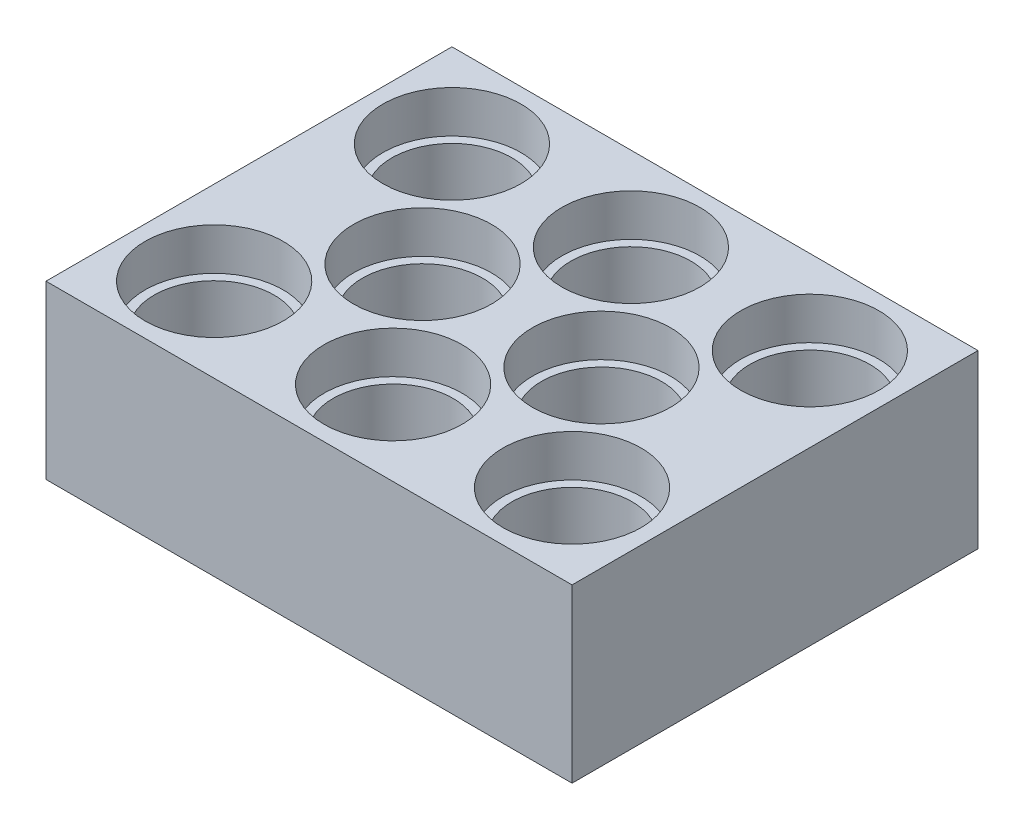
ISO-10303-21;
HEADER;
FILE_DESCRIPTION(('STEP AP214'),'2;1');
FILE_NAME('part.step','',(''),(''),'','','');
FILE_SCHEMA(('AUTOMOTIVE_DESIGN { 1 0 10303 214 1 1 1 1 }'));
ENDSEC;
DATA;
#1=APPLICATION_CONTEXT('core data for automotive mechanical design processes');
#2=APPLICATION_PROTOCOL_DEFINITION('international standard','automotive_design',2000,#1);
#3=PRODUCT_CONTEXT('',#1,'mechanical');
#4=PRODUCT('Part','Part','',(#3));
#5=PRODUCT_RELATED_PRODUCT_CATEGORY('part','',(#4));
#6=PRODUCT_DEFINITION_FORMATION('','',#4);
#7=PRODUCT_DEFINITION_CONTEXT('part definition',#1,'design');
#8=PRODUCT_DEFINITION('design','',#6,#7);
#9=PRODUCT_DEFINITION_SHAPE('','',#8);
#10=(LENGTH_UNIT() NAMED_UNIT(*) SI_UNIT(.MILLI.,.METRE.));
#11=(NAMED_UNIT(*) PLANE_ANGLE_UNIT() SI_UNIT($,.RADIAN.));
#12=(NAMED_UNIT(*) SI_UNIT($,.STERADIAN.) SOLID_ANGLE_UNIT());
#13=UNCERTAINTY_MEASURE_WITH_UNIT(LENGTH_MEASURE(1.E-05),#10,'distance_accuracy_value','');
#14=(GEOMETRIC_REPRESENTATION_CONTEXT(3) GLOBAL_UNCERTAINTY_ASSIGNED_CONTEXT((#13)) GLOBAL_UNIT_ASSIGNED_CONTEXT((#10,
#11,#12)) REPRESENTATION_CONTEXT('',''));
#15=CARTESIAN_POINT('',(0.,0.,0.));
#16=DIRECTION('',(0.,0.,1.));
#17=DIRECTION('',(1.,0.,0.));
#18=AXIS2_PLACEMENT_3D('',#15,#16,#17);
#19=CARTESIAN_POINT('',(219.,143.,169.));
#20=DIRECTION('',(-1.,0.,0.));
#21=DIRECTION('',(0.,0.,1.));
#22=AXIS2_PLACEMENT_3D('',#19,#20,#21);
#23=PLANE('',#22);
#24=DIRECTION('',(0.,0.,-1.));
#25=VECTOR('',#24,1.);
#26=CARTESIAN_POINT('',(219.,0.,169.));
#27=LINE('',#26,#25);
#28=CARTESIAN_POINT('',(219.,0.,169.));
#29=VERTEX_POINT('',#28);
#30=CARTESIAN_POINT('',(219.,0.,-169.));
#31=VERTEX_POINT('',#30);
#32=EDGE_CURVE('E111',#29,#31,#27,.T.);
#33=ORIENTED_EDGE('',*,*,#32,.T.);
#34=DIRECTION('',(0.,-1.,0.));
#35=VECTOR('',#34,1.);
#36=CARTESIAN_POINT('',(219.,143.,-169.));
#37=LINE('',#36,#35);
#38=CARTESIAN_POINT('',(219.,143.,-169.));
#39=VERTEX_POINT('',#38);
#40=EDGE_CURVE('E11',#39,#31,#37,.T.);
#41=ORIENTED_EDGE('',*,*,#40,.F.);
#42=DIRECTION('',(0.,0.,-1.));
#43=VECTOR('',#42,1.);
#44=CARTESIAN_POINT('',(219.,143.,169.));
#45=LINE('',#44,#43);
#46=CARTESIAN_POINT('',(219.,143.,169.));
#47=VERTEX_POINT('',#46);
#48=EDGE_CURVE('E92',#47,#39,#45,.T.);
#49=ORIENTED_EDGE('',*,*,#48,.F.);
#50=DIRECTION('',(0.,-1.,0.));
#51=VECTOR('',#50,1.);
#52=CARTESIAN_POINT('',(219.,143.,169.));
#53=LINE('',#52,#51);
#54=EDGE_CURVE('E107',#47,#29,#53,.T.);
#55=ORIENTED_EDGE('',*,*,#54,.T.);
#56=EDGE_LOOP('',(#33,#41,#49,#55));
#57=FACE_BOUND('',#56,.T.);
#58=ADVANCED_FACE('F38',(#57),#23,.F.);
#59=CARTESIAN_POINT('',(-219.,143.,-169.));
#60=DIRECTION('',(0.,0.,1.));
#61=DIRECTION('',(1.,0.,0.));
#62=AXIS2_PLACEMENT_3D('',#59,#60,#61);
#63=PLANE('',#62);
#64=DIRECTION('',(-1.,0.,0.));
#65=VECTOR('',#64,1.);
#66=CARTESIAN_POINT('',(-219.,0.,-169.));
#67=LINE('',#66,#65);
#68=CARTESIAN_POINT('',(-219.,0.,-169.));
#69=VERTEX_POINT('',#68);
#70=EDGE_CURVE('E97',#31,#69,#67,.T.);
#71=ORIENTED_EDGE('',*,*,#70,.T.);
#72=DIRECTION('',(0.,-1.,0.));
#73=VECTOR('',#72,1.);
#74=CARTESIAN_POINT('',(-219.,143.,-169.));
#75=LINE('',#74,#73);
#76=CARTESIAN_POINT('',(-219.,143.,-169.));
#77=VERTEX_POINT('',#76);
#78=EDGE_CURVE('E48',#77,#69,#75,.T.);
#79=ORIENTED_EDGE('',*,*,#78,.F.);
#80=DIRECTION('',(-1.,0.,0.));
#81=VECTOR('',#80,1.);
#82=CARTESIAN_POINT('',(-219.,143.,-169.));
#83=LINE('',#82,#81);
#84=EDGE_CURVE('E87',#39,#77,#83,.T.);
#85=ORIENTED_EDGE('',*,*,#84,.F.);
#86=ORIENTED_EDGE('',*,*,#40,.T.);
#87=EDGE_LOOP('',(#71,#79,#85,#86));
#88=FACE_BOUND('',#87,.T.);
#89=ADVANCED_FACE('F96',(#88),#63,.F.);
#90=CARTESIAN_POINT('',(-219.,143.,169.));
#91=DIRECTION('',(1.,0.,0.));
#92=DIRECTION('',(0.,0.,-1.));
#93=AXIS2_PLACEMENT_3D('',#90,#91,#92);
#94=PLANE('',#93);
#95=DIRECTION('',(0.,0.,1.));
#96=VECTOR('',#95,1.);
#97=CARTESIAN_POINT('',(-219.,0.,169.));
#98=LINE('',#97,#96);
#99=CARTESIAN_POINT('',(-219.,0.,169.));
#100=VERTEX_POINT('',#99);
#101=EDGE_CURVE('E74',#69,#100,#98,.T.);
#102=ORIENTED_EDGE('',*,*,#101,.T.);
#103=DIRECTION('',(0.,-1.,0.));
#104=VECTOR('',#103,1.);
#105=CARTESIAN_POINT('',(-219.,143.,169.));
#106=LINE('',#105,#104);
#107=CARTESIAN_POINT('',(-219.,143.,169.));
#108=VERTEX_POINT('',#107);
#109=EDGE_CURVE('E99',#108,#100,#106,.T.);
#110=ORIENTED_EDGE('',*,*,#109,.F.);
#111=DIRECTION('',(0.,0.,1.));
#112=VECTOR('',#111,1.);
#113=CARTESIAN_POINT('',(-219.,143.,169.));
#114=LINE('',#113,#112);
#115=EDGE_CURVE('E90',#77,#108,#114,.T.);
#116=ORIENTED_EDGE('',*,*,#115,.F.);
#117=ORIENTED_EDGE('',*,*,#78,.T.);
#118=EDGE_LOOP('',(#102,#110,#116,#117));
#119=FACE_BOUND('',#118,.T.);
#120=ADVANCED_FACE('F101',(#119),#94,.F.);
#121=CARTESIAN_POINT('',(-219.,143.,169.));
#122=DIRECTION('',(0.,0.,-1.));
#123=DIRECTION('',(-1.,0.,0.));
#124=AXIS2_PLACEMENT_3D('',#121,#122,#123);
#125=PLANE('',#124);
#126=DIRECTION('',(1.,0.,0.));
#127=VECTOR('',#126,1.);
#128=CARTESIAN_POINT('',(-219.,0.,169.));
#129=LINE('',#128,#127);
#130=EDGE_CURVE('E80',#100,#29,#129,.T.);
#131=ORIENTED_EDGE('',*,*,#130,.T.);
#132=ORIENTED_EDGE('',*,*,#54,.F.);
#133=DIRECTION('',(1.,0.,0.));
#134=VECTOR('',#133,1.);
#135=CARTESIAN_POINT('',(-219.,143.,169.));
#136=LINE('',#135,#134);
#137=EDGE_CURVE('E57',#108,#47,#136,.T.);
#138=ORIENTED_EDGE('',*,*,#137,.F.);
#139=ORIENTED_EDGE('',*,*,#109,.T.);
#140=EDGE_LOOP('',(#131,#132,#138,#139));
#141=FACE_BOUND('',#140,.T.);
#142=ADVANCED_FACE('F230',(#141),#125,.F.);
#143=CARTESIAN_POINT('',(0.,143.,0.));
#144=DIRECTION('',(0.,-1.,0.));
#145=DIRECTION('',(0.,0.,-1.));
#146=AXIS2_PLACEMENT_3D('',#143,#144,#145);
#147=PLANE('',#146);
#148=CARTESIAN_POINT('',(-149.,143.,99.));
#149=DIRECTION('',(0.,1.,0.));
#150=DIRECTION('',(0.,0.,1.));
#151=AXIS2_PLACEMENT_3D('',#148,#149,#150);
#152=CIRCLE('',#151,57.5);
#153=CARTESIAN_POINT('',(-149.,143.,156.5));
#154=VERTEX_POINT('',#153);
#155=EDGE_CURVE('E691',#154,#154,#152,.T.);
#156=ORIENTED_EDGE('',*,*,#155,.F.);
#157=EDGE_LOOP('',(#156));
#158=FACE_BOUND('',#157,.T.);
#159=CARTESIAN_POINT('',(-74.4999999999989,143.,0.));
#160=DIRECTION('',(0.,1.,0.));
#161=DIRECTION('',(0.,0.,1.));
#162=AXIS2_PLACEMENT_3D('',#159,#160,#161);
#163=CIRCLE('',#162,57.5);
#164=CARTESIAN_POINT('',(-74.4999999999989,143.,57.5));
#165=VERTEX_POINT('',#164);
#166=EDGE_CURVE('E676',#165,#165,#163,.T.);
#167=ORIENTED_EDGE('',*,*,#166,.F.);
#168=EDGE_LOOP('',(#167));
#169=FACE_BOUND('',#168,.T.);
#170=CARTESIAN_POINT('',(2.09381123550401E-12,143.,99.));
#171=DIRECTION('',(0.,1.,0.));
#172=DIRECTION('',(0.,0.,1.));
#173=AXIS2_PLACEMENT_3D('',#170,#171,#172);
#174=CIRCLE('',#173,57.5);
#175=CARTESIAN_POINT('',(2.09381123550401E-12,143.,156.5));
#176=VERTEX_POINT('',#175);
#177=EDGE_CURVE('E211',#176,#176,#174,.T.);
#178=ORIENTED_EDGE('',*,*,#177,.F.);
#179=EDGE_LOOP('',(#178));
#180=FACE_BOUND('',#179,.T.);
#181=CARTESIAN_POINT('',(-1.7503359872606E-12,143.,-99.));
#182=DIRECTION('',(0.,1.,0.));
#183=DIRECTION('',(0.,0.,1.));
#184=AXIS2_PLACEMENT_3D('',#181,#182,#183);
#185=CIRCLE('',#184,57.5);
#186=CARTESIAN_POINT('',(-1.7503359872606E-12,143.,-41.5));
#187=VERTEX_POINT('',#186);
#188=EDGE_CURVE('E200',#187,#187,#185,.T.);
#189=ORIENTED_EDGE('',*,*,#188,.F.);
#190=EDGE_LOOP('',(#189));
#191=FACE_BOUND('',#190,.T.);
#192=CARTESIAN_POINT('',(74.5000000000011,143.,0.));
#193=DIRECTION('',(0.,1.,0.));
#194=DIRECTION('',(0.,0.,1.));
#195=AXIS2_PLACEMENT_3D('',#192,#193,#194);
#196=CIRCLE('',#195,57.5);
#197=CARTESIAN_POINT('',(74.5000000000011,143.,57.5));
#198=VERTEX_POINT('',#197);
#199=EDGE_CURVE('E707',#198,#198,#196,.T.);
#200=ORIENTED_EDGE('',*,*,#199,.F.);
#201=EDGE_LOOP('',(#200));
#202=FACE_BOUND('',#201,.T.);
#203=CARTESIAN_POINT('',(149.,143.,99.));
#204=DIRECTION('',(0.,1.,0.));
#205=DIRECTION('',(0.,0.,1.));
#206=AXIS2_PLACEMENT_3D('',#203,#204,#205);
#207=CIRCLE('',#206,57.5);
#208=CARTESIAN_POINT('',(149.,143.,156.5));
#209=VERTEX_POINT('',#208);
#210=EDGE_CURVE('E680',#209,#209,#207,.T.);
#211=ORIENTED_EDGE('',*,*,#210,.F.);
#212=EDGE_LOOP('',(#211));
#213=FACE_BOUND('',#212,.T.);
#214=CARTESIAN_POINT('',(149.,143.,-99.));
#215=DIRECTION('',(0.,1.,0.));
#216=DIRECTION('',(0.,0.,1.));
#217=AXIS2_PLACEMENT_3D('',#214,#215,#216);
#218=CIRCLE('',#217,57.5);
#219=CARTESIAN_POINT('',(149.,143.,-41.5));
#220=VERTEX_POINT('',#219);
#221=EDGE_CURVE('E670',#220,#220,#218,.T.);
#222=ORIENTED_EDGE('',*,*,#221,.F.);
#223=EDGE_LOOP('',(#222));
#224=FACE_BOUND('',#223,.T.);
#225=CARTESIAN_POINT('',(-149.,143.,-99.));
#226=DIRECTION('',(0.,1.,0.));
#227=DIRECTION('',(0.,0.,1.));
#228=AXIS2_PLACEMENT_3D('',#225,#226,#227);
#229=CIRCLE('',#228,57.5);
#230=CARTESIAN_POINT('',(-149.,143.,-41.5));
#231=VERTEX_POINT('',#230);
#232=EDGE_CURVE('E174',#231,#231,#229,.T.);
#233=ORIENTED_EDGE('',*,*,#232,.F.);
#234=EDGE_LOOP('',(#233));
#235=FACE_BOUND('',#234,.T.);
#236=ORIENTED_EDGE('',*,*,#48,.T.);
#237=ORIENTED_EDGE('',*,*,#84,.T.);
#238=ORIENTED_EDGE('',*,*,#115,.T.);
#239=ORIENTED_EDGE('',*,*,#137,.T.);
#240=EDGE_LOOP('',(#236,#237,#238,#239));
#241=FACE_BOUND('',#240,.T.);
#242=ADVANCED_FACE('F88',(#158,#169,#180,#191,#202,#213,#224,#235,#241),#147,.F.);
#243=CARTESIAN_POINT('',(0.,0.,0.));
#244=DIRECTION('',(0.,-1.,0.));
#245=DIRECTION('',(0.,0.,-1.));
#246=AXIS2_PLACEMENT_3D('',#243,#244,#245);
#247=PLANE('',#246);
#248=ORIENTED_EDGE('',*,*,#32,.F.);
#249=ORIENTED_EDGE('',*,*,#130,.F.);
#250=ORIENTED_EDGE('',*,*,#101,.F.);
#251=ORIENTED_EDGE('',*,*,#70,.F.);
#252=EDGE_LOOP('',(#248,#249,#250,#251));
#253=FACE_BOUND('',#252,.T.);
#254=ADVANCED_FACE('F229',(#253),#247,.T.);
#255=CARTESIAN_POINT('',(-149.,108.,99.));
#256=DIRECTION('',(0.,1.,0.));
#257=DIRECTION('',(0.,0.,1.));
#258=AXIS2_PLACEMENT_3D('',#255,#256,#257);
#259=PLANE('',#258);
#260=CARTESIAN_POINT('',(-149.,108.,99.));
#261=DIRECTION('',(0.,1.,0.));
#262=DIRECTION('',(0.,0.,1.));
#263=AXIS2_PLACEMENT_3D('',#260,#261,#262);
#264=CIRCLE('',#263,57.5);
#265=CARTESIAN_POINT('',(-149.,108.,156.5));
#266=VERTEX_POINT('',#265);
#267=EDGE_CURVE('E216',#266,#266,#264,.T.);
#268=ORIENTED_EDGE('',*,*,#267,.T.);
#269=EDGE_LOOP('',(#268));
#270=FACE_BOUND('',#269,.T.);
#271=CARTESIAN_POINT('',(-148.999999999998,108.,99.));
#272=DIRECTION('',(0.,1.,0.));
#273=DIRECTION('',(0.,0.,1.));
#274=AXIS2_PLACEMENT_3D('',#271,#272,#273);
#275=CIRCLE('',#274,50.);
#276=CARTESIAN_POINT('',(-148.999999999998,108.,149.));
#277=VERTEX_POINT('',#276);
#278=EDGE_CURVE('E126',#277,#277,#275,.F.);
#279=ORIENTED_EDGE('',*,*,#278,.T.);
#280=EDGE_LOOP('',(#279));
#281=FACE_BOUND('',#280,.T.);
#282=ADVANCED_FACE('F237',(#270,#281),#259,.T.);
#283=CARTESIAN_POINT('',(-149.,108.,99.));
#284=DIRECTION('',(0.,1.,0.));
#285=DIRECTION('',(0.,0.,1.));
#286=AXIS2_PLACEMENT_3D('',#283,#284,#285);
#287=CYLINDRICAL_SURFACE('',#286,57.5);
#288=ORIENTED_EDGE('',*,*,#267,.F.);
#289=EDGE_LOOP('',(#288));
#290=FACE_BOUND('',#289,.T.);
#291=ORIENTED_EDGE('',*,*,#155,.T.);
#292=EDGE_LOOP('',(#291));
#293=FACE_BOUND('',#292,.T.);
#294=ADVANCED_FACE('F276',(#290,#293),#287,.F.);
#295=CARTESIAN_POINT('',(-74.4999999999989,108.,0.));
#296=DIRECTION('',(0.,1.,0.));
#297=DIRECTION('',(0.,0.,1.));
#298=AXIS2_PLACEMENT_3D('',#295,#296,#297);
#299=PLANE('',#298);
#300=CARTESIAN_POINT('',(-74.4999999999989,108.,0.));
#301=DIRECTION('',(0.,1.,0.));
#302=DIRECTION('',(0.,0.,1.));
#303=AXIS2_PLACEMENT_3D('',#300,#301,#302);
#304=CIRCLE('',#303,57.5);
#305=CARTESIAN_POINT('',(-74.4999999999989,108.,57.5));
#306=VERTEX_POINT('',#305);
#307=EDGE_CURVE('E688',#306,#306,#304,.T.);
#308=ORIENTED_EDGE('',*,*,#307,.T.);
#309=EDGE_LOOP('',(#308));
#310=FACE_BOUND('',#309,.T.);
#311=CARTESIAN_POINT('',(-74.4999999999989,108.,0.));
#312=DIRECTION('',(0.,1.,0.));
#313=DIRECTION('',(0.,0.,1.));
#314=AXIS2_PLACEMENT_3D('',#311,#312,#313);
#315=CIRCLE('',#314,50.);
#316=CARTESIAN_POINT('',(-74.4999999999989,108.,50.));
#317=VERTEX_POINT('',#316);
#318=EDGE_CURVE('E129',#317,#317,#315,.F.);
#319=ORIENTED_EDGE('',*,*,#318,.T.);
#320=EDGE_LOOP('',(#319));
#321=FACE_BOUND('',#320,.T.);
#322=ADVANCED_FACE('F285',(#310,#321),#299,.T.);
#323=CARTESIAN_POINT('',(-74.4999999999989,108.,0.));
#324=DIRECTION('',(0.,1.,0.));
#325=DIRECTION('',(0.,0.,1.));
#326=AXIS2_PLACEMENT_3D('',#323,#324,#325);
#327=CYLINDRICAL_SURFACE('',#326,57.5);
#328=ORIENTED_EDGE('',*,*,#307,.F.);
#329=EDGE_LOOP('',(#328));
#330=FACE_BOUND('',#329,.T.);
#331=ORIENTED_EDGE('',*,*,#166,.T.);
#332=EDGE_LOOP('',(#331));
#333=FACE_BOUND('',#332,.T.);
#334=ADVANCED_FACE('F294',(#330,#333),#327,.F.);
#335=CARTESIAN_POINT('',(2.09381123550401E-12,108.,99.));
#336=DIRECTION('',(0.,1.,0.));
#337=DIRECTION('',(0.,0.,1.));
#338=AXIS2_PLACEMENT_3D('',#335,#336,#337);
#339=PLANE('',#338);
#340=CARTESIAN_POINT('',(2.09381123550401E-12,108.,99.));
#341=DIRECTION('',(0.,1.,0.));
#342=DIRECTION('',(0.,0.,1.));
#343=AXIS2_PLACEMENT_3D('',#340,#341,#342);
#344=CIRCLE('',#343,57.5);
#345=CARTESIAN_POINT('',(2.09381123550401E-12,108.,156.5));
#346=VERTEX_POINT('',#345);
#347=EDGE_CURVE('E203',#346,#346,#344,.T.);
#348=ORIENTED_EDGE('',*,*,#347,.T.);
#349=EDGE_LOOP('',(#348));
#350=FACE_BOUND('',#349,.T.);
#351=CARTESIAN_POINT('',(2.07911930933463E-12,108.,99.));
#352=DIRECTION('',(0.,1.,0.));
#353=DIRECTION('',(0.,0.,1.));
#354=AXIS2_PLACEMENT_3D('',#351,#352,#353);
#355=CIRCLE('',#354,50.);
#356=CARTESIAN_POINT('',(2.07911930933463E-12,108.,149.));
#357=VERTEX_POINT('',#356);
#358=EDGE_CURVE('E134',#357,#357,#355,.F.);
#359=ORIENTED_EDGE('',*,*,#358,.T.);
#360=EDGE_LOOP('',(#359));
#361=FACE_BOUND('',#360,.T.);
#362=ADVANCED_FACE('F303',(#350,#361),#339,.T.);
#363=CARTESIAN_POINT('',(2.09381123550401E-12,108.,99.));
#364=DIRECTION('',(0.,1.,0.));
#365=DIRECTION('',(0.,0.,1.));
#366=AXIS2_PLACEMENT_3D('',#363,#364,#365);
#367=CYLINDRICAL_SURFACE('',#366,57.5);
#368=ORIENTED_EDGE('',*,*,#347,.F.);
#369=EDGE_LOOP('',(#368));
#370=FACE_BOUND('',#369,.T.);
#371=ORIENTED_EDGE('',*,*,#177,.T.);
#372=EDGE_LOOP('',(#371));
#373=FACE_BOUND('',#372,.T.);
#374=ADVANCED_FACE('F312',(#370,#373),#367,.F.);
#375=CARTESIAN_POINT('',(-1.7503359872606E-12,108.,-99.));
#376=DIRECTION('',(0.,1.,0.));
#377=DIRECTION('',(0.,0.,1.));
#378=AXIS2_PLACEMENT_3D('',#375,#376,#377);
#379=PLANE('',#378);
#380=CARTESIAN_POINT('',(-1.7503359872606E-12,108.,-99.));
#381=DIRECTION('',(0.,1.,0.));
#382=DIRECTION('',(0.,0.,1.));
#383=AXIS2_PLACEMENT_3D('',#380,#381,#382);
#384=CIRCLE('',#383,57.5);
#385=CARTESIAN_POINT('',(-1.7503359872606E-12,108.,-41.5));
#386=VERTEX_POINT('',#385);
#387=EDGE_CURVE('E202',#386,#386,#384,.T.);
#388=ORIENTED_EDGE('',*,*,#387,.T.);
#389=EDGE_LOOP('',(#388));
#390=FACE_BOUND('',#389,.T.);
#391=CARTESIAN_POINT('',(1.11022302462516E-13,108.,-99.));
#392=DIRECTION('',(0.,1.,0.));
#393=DIRECTION('',(0.,0.,1.));
#394=AXIS2_PLACEMENT_3D('',#391,#392,#393);
#395=CIRCLE('',#394,50.);
#396=CARTESIAN_POINT('',(1.11022302462516E-13,108.,-49.));
#397=VERTEX_POINT('',#396);
#398=EDGE_CURVE('E138',#397,#397,#395,.F.);
#399=ORIENTED_EDGE('',*,*,#398,.T.);
#400=EDGE_LOOP('',(#399));
#401=FACE_BOUND('',#400,.T.);
#402=ADVANCED_FACE('F321',(#390,#401),#379,.T.);
#403=CARTESIAN_POINT('',(-1.7503359872606E-12,108.,-99.));
#404=DIRECTION('',(0.,1.,0.));
#405=DIRECTION('',(0.,0.,1.));
#406=AXIS2_PLACEMENT_3D('',#403,#404,#405);
#407=CYLINDRICAL_SURFACE('',#406,57.5);
#408=ORIENTED_EDGE('',*,*,#387,.F.);
#409=EDGE_LOOP('',(#408));
#410=FACE_BOUND('',#409,.T.);
#411=ORIENTED_EDGE('',*,*,#188,.T.);
#412=EDGE_LOOP('',(#411));
#413=FACE_BOUND('',#412,.T.);
#414=ADVANCED_FACE('F330',(#410,#413),#407,.F.);
#415=CARTESIAN_POINT('',(74.5000000000011,108.,0.));
#416=DIRECTION('',(0.,1.,0.));
#417=DIRECTION('',(0.,0.,1.));
#418=AXIS2_PLACEMENT_3D('',#415,#416,#417);
#419=PLANE('',#418);
#420=CARTESIAN_POINT('',(74.5000000000011,108.,0.));
#421=DIRECTION('',(0.,1.,0.));
#422=DIRECTION('',(0.,0.,1.));
#423=AXIS2_PLACEMENT_3D('',#420,#421,#422);
#424=CIRCLE('',#423,57.5);
#425=CARTESIAN_POINT('',(74.5000000000011,108.,57.5));
#426=VERTEX_POINT('',#425);
#427=EDGE_CURVE('E687',#426,#426,#424,.T.);
#428=ORIENTED_EDGE('',*,*,#427,.T.);
#429=EDGE_LOOP('',(#428));
#430=FACE_BOUND('',#429,.T.);
#431=CARTESIAN_POINT('',(74.5000000000011,108.,0.));
#432=DIRECTION('',(0.,1.,0.));
#433=DIRECTION('',(0.,0.,1.));
#434=AXIS2_PLACEMENT_3D('',#431,#432,#433);
#435=CIRCLE('',#434,50.);
#436=CARTESIAN_POINT('',(74.5000000000011,108.,50.));
#437=VERTEX_POINT('',#436);
#438=EDGE_CURVE('E142',#437,#437,#435,.F.);
#439=ORIENTED_EDGE('',*,*,#438,.T.);
#440=EDGE_LOOP('',(#439));
#441=FACE_BOUND('',#440,.T.);
#442=ADVANCED_FACE('F339',(#430,#441),#419,.T.);
#443=CARTESIAN_POINT('',(74.5000000000011,108.,0.));
#444=DIRECTION('',(0.,1.,0.));
#445=DIRECTION('',(0.,0.,1.));
#446=AXIS2_PLACEMENT_3D('',#443,#444,#445);
#447=CYLINDRICAL_SURFACE('',#446,57.5);
#448=ORIENTED_EDGE('',*,*,#427,.F.);
#449=EDGE_LOOP('',(#448));
#450=FACE_BOUND('',#449,.T.);
#451=ORIENTED_EDGE('',*,*,#199,.T.);
#452=EDGE_LOOP('',(#451));
#453=FACE_BOUND('',#452,.T.);
#454=ADVANCED_FACE('F348',(#450,#453),#447,.F.);
#455=CARTESIAN_POINT('',(149.,108.,99.));
#456=DIRECTION('',(0.,1.,0.));
#457=DIRECTION('',(0.,0.,1.));
#458=AXIS2_PLACEMENT_3D('',#455,#456,#457);
#459=PLANE('',#458);
#460=CARTESIAN_POINT('',(149.,108.,99.));
#461=DIRECTION('',(0.,1.,0.));
#462=DIRECTION('',(0.,0.,1.));
#463=AXIS2_PLACEMENT_3D('',#460,#461,#462);
#464=CIRCLE('',#463,57.5);
#465=CARTESIAN_POINT('',(149.,108.,156.5));
#466=VERTEX_POINT('',#465);
#467=EDGE_CURVE('E673',#466,#466,#464,.T.);
#468=ORIENTED_EDGE('',*,*,#467,.T.);
#469=EDGE_LOOP('',(#468));
#470=FACE_BOUND('',#469,.T.);
#471=CARTESIAN_POINT('',(149.000000000002,108.,99.));
#472=DIRECTION('',(0.,1.,0.));
#473=DIRECTION('',(0.,0.,1.));
#474=AXIS2_PLACEMENT_3D('',#471,#472,#473);
#475=CIRCLE('',#474,50.);
#476=CARTESIAN_POINT('',(149.000000000002,108.,149.));
#477=VERTEX_POINT('',#476);
#478=EDGE_CURVE('E146',#477,#477,#475,.F.);
#479=ORIENTED_EDGE('',*,*,#478,.T.);
#480=EDGE_LOOP('',(#479));
#481=FACE_BOUND('',#480,.T.);
#482=ADVANCED_FACE('F357',(#470,#481),#459,.T.);
#483=CARTESIAN_POINT('',(149.,108.,99.));
#484=DIRECTION('',(0.,1.,0.));
#485=DIRECTION('',(0.,0.,1.));
#486=AXIS2_PLACEMENT_3D('',#483,#484,#485);
#487=CYLINDRICAL_SURFACE('',#486,57.5);
#488=ORIENTED_EDGE('',*,*,#467,.F.);
#489=EDGE_LOOP('',(#488));
#490=FACE_BOUND('',#489,.T.);
#491=ORIENTED_EDGE('',*,*,#210,.T.);
#492=EDGE_LOOP('',(#491));
#493=FACE_BOUND('',#492,.T.);
#494=ADVANCED_FACE('F366',(#490,#493),#487,.F.);
#495=CARTESIAN_POINT('',(149.,108.,-99.));
#496=DIRECTION('',(0.,1.,0.));
#497=DIRECTION('',(0.,0.,1.));
#498=AXIS2_PLACEMENT_3D('',#495,#496,#497);
#499=PLANE('',#498);
#500=CARTESIAN_POINT('',(149.,108.,-99.));
#501=DIRECTION('',(0.,1.,0.));
#502=DIRECTION('',(0.,0.,1.));
#503=AXIS2_PLACEMENT_3D('',#500,#501,#502);
#504=CIRCLE('',#503,57.5);
#505=CARTESIAN_POINT('',(149.,108.,-41.5));
#506=VERTEX_POINT('',#505);
#507=EDGE_CURVE('E667',#506,#506,#504,.T.);
#508=ORIENTED_EDGE('',*,*,#507,.T.);
#509=EDGE_LOOP('',(#508));
#510=FACE_BOUND('',#509,.T.);
#511=CARTESIAN_POINT('',(149.,108.,-99.));
#512=DIRECTION('',(0.,1.,0.));
#513=DIRECTION('',(0.,0.,1.));
#514=AXIS2_PLACEMENT_3D('',#511,#512,#513);
#515=CIRCLE('',#514,50.);
#516=CARTESIAN_POINT('',(149.,108.,-49.));
#517=VERTEX_POINT('',#516);
#518=EDGE_CURVE('E149',#517,#517,#515,.F.);
#519=ORIENTED_EDGE('',*,*,#518,.T.);
#520=EDGE_LOOP('',(#519));
#521=FACE_BOUND('',#520,.T.);
#522=ADVANCED_FACE('F375',(#510,#521),#499,.T.);
#523=CARTESIAN_POINT('',(149.,108.,-99.));
#524=DIRECTION('',(0.,1.,0.));
#525=DIRECTION('',(0.,0.,1.));
#526=AXIS2_PLACEMENT_3D('',#523,#524,#525);
#527=CYLINDRICAL_SURFACE('',#526,57.5);
#528=ORIENTED_EDGE('',*,*,#507,.F.);
#529=EDGE_LOOP('',(#528));
#530=FACE_BOUND('',#529,.T.);
#531=ORIENTED_EDGE('',*,*,#221,.T.);
#532=EDGE_LOOP('',(#531));
#533=FACE_BOUND('',#532,.T.);
#534=ADVANCED_FACE('F384',(#530,#533),#527,.F.);
#535=CARTESIAN_POINT('',(-149.,108.,-99.));
#536=DIRECTION('',(0.,1.,0.));
#537=DIRECTION('',(0.,0.,1.));
#538=AXIS2_PLACEMENT_3D('',#535,#536,#537);
#539=PLANE('',#538);
#540=CARTESIAN_POINT('',(-149.,108.,-99.));
#541=DIRECTION('',(0.,1.,0.));
#542=DIRECTION('',(0.,0.,1.));
#543=AXIS2_PLACEMENT_3D('',#540,#541,#542);
#544=CIRCLE('',#543,57.5);
#545=CARTESIAN_POINT('',(-149.,108.,-41.5));
#546=VERTEX_POINT('',#545);
#547=EDGE_CURVE('E130',#546,#546,#544,.T.);
#548=ORIENTED_EDGE('',*,*,#547,.T.);
#549=EDGE_LOOP('',(#548));
#550=FACE_BOUND('',#549,.T.);
#551=CARTESIAN_POINT('',(-149.,108.,-99.));
#552=DIRECTION('',(0.,1.,0.));
#553=DIRECTION('',(0.,0.,1.));
#554=AXIS2_PLACEMENT_3D('',#551,#552,#553);
#555=CIRCLE('',#554,50.);
#556=CARTESIAN_POINT('',(-149.,108.,-49.));
#557=VERTEX_POINT('',#556);
#558=EDGE_CURVE('E41',#557,#557,#555,.F.);
#559=ORIENTED_EDGE('',*,*,#558,.T.);
#560=EDGE_LOOP('',(#559));
#561=FACE_BOUND('',#560,.T.);
#562=ADVANCED_FACE('F393',(#550,#561),#539,.T.);
#563=CARTESIAN_POINT('',(-149.,108.,-99.));
#564=DIRECTION('',(0.,1.,0.));
#565=DIRECTION('',(0.,0.,1.));
#566=AXIS2_PLACEMENT_3D('',#563,#564,#565);
#567=CYLINDRICAL_SURFACE('',#566,57.5);
#568=ORIENTED_EDGE('',*,*,#547,.F.);
#569=EDGE_LOOP('',(#568));
#570=FACE_BOUND('',#569,.T.);
#571=ORIENTED_EDGE('',*,*,#232,.T.);
#572=EDGE_LOOP('',(#571));
#573=FACE_BOUND('',#572,.T.);
#574=ADVANCED_FACE('F226',(#570,#573),#567,.F.);
#575=CARTESIAN_POINT('',(-148.999999999998,7.99999999999998,99.));
#576=DIRECTION('',(0.,1.,0.));
#577=DIRECTION('',(0.,0.,1.));
#578=AXIS2_PLACEMENT_3D('',#575,#576,#577);
#579=PLANE('',#578);
#580=CARTESIAN_POINT('',(-148.999999999998,7.99999999999998,99.));
#581=DIRECTION('',(0.,1.,0.));
#582=DIRECTION('',(0.,0.,1.));
#583=AXIS2_PLACEMENT_3D('',#580,#581,#582);
#584=CIRCLE('',#583,50.);
#585=CARTESIAN_POINT('',(-148.999999999998,7.99999999999998,149.));
#586=VERTEX_POINT('',#585);
#587=EDGE_CURVE('E183',#586,#586,#584,.T.);
#588=ORIENTED_EDGE('',*,*,#587,.T.);
#589=EDGE_LOOP('',(#588));
#590=FACE_BOUND('',#589,.T.);
#591=ADVANCED_FACE('F409',(#590),#579,.T.);
#592=CARTESIAN_POINT('',(-148.999999999998,7.99999999999998,99.));
#593=DIRECTION('',(0.,1.,0.));
#594=DIRECTION('',(0.,0.,1.));
#595=AXIS2_PLACEMENT_3D('',#592,#593,#594);
#596=CYLINDRICAL_SURFACE('',#595,50.);
#597=ORIENTED_EDGE('',*,*,#587,.F.);
#598=EDGE_LOOP('',(#597));
#599=FACE_BOUND('',#598,.T.);
#600=ORIENTED_EDGE('',*,*,#278,.F.);
#601=EDGE_LOOP('',(#600));
#602=FACE_BOUND('',#601,.T.);
#603=ADVANCED_FACE('F418',(#599,#602),#596,.F.);
#604=CARTESIAN_POINT('',(-74.4999999999989,7.99999999999998,0.));
#605=DIRECTION('',(0.,1.,0.));
#606=DIRECTION('',(0.,0.,1.));
#607=AXIS2_PLACEMENT_3D('',#604,#605,#606);
#608=PLANE('',#607);
#609=CARTESIAN_POINT('',(-74.4999999999989,7.99999999999998,0.));
#610=DIRECTION('',(0.,1.,0.));
#611=DIRECTION('',(0.,0.,1.));
#612=AXIS2_PLACEMENT_3D('',#609,#610,#611);
#613=CIRCLE('',#612,50.);
#614=CARTESIAN_POINT('',(-74.4999999999989,7.99999999999998,50.));
#615=VERTEX_POINT('',#614);
#616=EDGE_CURVE('E178',#615,#615,#613,.T.);
#617=ORIENTED_EDGE('',*,*,#616,.T.);
#618=EDGE_LOOP('',(#617));
#619=FACE_BOUND('',#618,.T.);
#620=ADVANCED_FACE('F427',(#619),#608,.T.);
#621=CARTESIAN_POINT('',(-74.4999999999989,7.99999999999998,0.));
#622=DIRECTION('',(0.,1.,0.));
#623=DIRECTION('',(0.,0.,1.));
#624=AXIS2_PLACEMENT_3D('',#621,#622,#623);
#625=CYLINDRICAL_SURFACE('',#624,50.);
#626=ORIENTED_EDGE('',*,*,#616,.F.);
#627=EDGE_LOOP('',(#626));
#628=FACE_BOUND('',#627,.T.);
#629=ORIENTED_EDGE('',*,*,#318,.F.);
#630=EDGE_LOOP('',(#629));
#631=FACE_BOUND('',#630,.T.);
#632=ADVANCED_FACE('F436',(#628,#631),#625,.F.);
#633=CARTESIAN_POINT('',(2.07911930933463E-12,7.99999999999998,99.));
#634=DIRECTION('',(0.,1.,0.));
#635=DIRECTION('',(0.,0.,1.));
#636=AXIS2_PLACEMENT_3D('',#633,#634,#635);
#637=PLANE('',#636);
#638=CARTESIAN_POINT('',(2.07911930933463E-12,7.99999999999998,99.));
#639=DIRECTION('',(0.,1.,0.));
#640=DIRECTION('',(0.,0.,1.));
#641=AXIS2_PLACEMENT_3D('',#638,#639,#640);
#642=CIRCLE('',#641,50.);
#643=CARTESIAN_POINT('',(2.07911930933463E-12,7.99999999999998,149.));
#644=VERTEX_POINT('',#643);
#645=EDGE_CURVE('E187',#644,#644,#642,.T.);
#646=ORIENTED_EDGE('',*,*,#645,.T.);
#647=EDGE_LOOP('',(#646));
#648=FACE_BOUND('',#647,.T.);
#649=ADVANCED_FACE('F445',(#648),#637,.T.);
#650=CARTESIAN_POINT('',(2.07911930933463E-12,7.99999999999998,99.));
#651=DIRECTION('',(0.,1.,0.));
#652=DIRECTION('',(0.,0.,1.));
#653=AXIS2_PLACEMENT_3D('',#650,#651,#652);
#654=CYLINDRICAL_SURFACE('',#653,50.);
#655=ORIENTED_EDGE('',*,*,#645,.F.);
#656=EDGE_LOOP('',(#655));
#657=FACE_BOUND('',#656,.T.);
#658=ORIENTED_EDGE('',*,*,#358,.F.);
#659=EDGE_LOOP('',(#658));
#660=FACE_BOUND('',#659,.T.);
#661=ADVANCED_FACE('F454',(#657,#660),#654,.F.);
#662=CARTESIAN_POINT('',(1.11022302462516E-13,7.99999999999998,-99.));
#663=DIRECTION('',(0.,1.,0.));
#664=DIRECTION('',(0.,0.,1.));
#665=AXIS2_PLACEMENT_3D('',#662,#663,#664);
#666=PLANE('',#665);
#667=CARTESIAN_POINT('',(1.11022302462516E-13,7.99999999999998,-99.));
#668=DIRECTION('',(0.,1.,0.));
#669=DIRECTION('',(0.,0.,1.));
#670=AXIS2_PLACEMENT_3D('',#667,#668,#669);
#671=CIRCLE('',#670,50.);
#672=CARTESIAN_POINT('',(1.11022302462516E-13,7.99999999999998,-49.));
#673=VERTEX_POINT('',#672);
#674=EDGE_CURVE('E188',#673,#673,#671,.T.);
#675=ORIENTED_EDGE('',*,*,#674,.T.);
#676=EDGE_LOOP('',(#675));
#677=FACE_BOUND('',#676,.T.);
#678=ADVANCED_FACE('F463',(#677),#666,.T.);
#679=CARTESIAN_POINT('',(1.11022302462516E-13,7.99999999999998,-99.));
#680=DIRECTION('',(0.,1.,0.));
#681=DIRECTION('',(0.,0.,1.));
#682=AXIS2_PLACEMENT_3D('',#679,#680,#681);
#683=CYLINDRICAL_SURFACE('',#682,50.);
#684=ORIENTED_EDGE('',*,*,#674,.F.);
#685=EDGE_LOOP('',(#684));
#686=FACE_BOUND('',#685,.T.);
#687=ORIENTED_EDGE('',*,*,#398,.F.);
#688=EDGE_LOOP('',(#687));
#689=FACE_BOUND('',#688,.T.);
#690=ADVANCED_FACE('F472',(#686,#689),#683,.F.);
#691=CARTESIAN_POINT('',(74.5000000000011,7.99999999999998,0.));
#692=DIRECTION('',(0.,1.,0.));
#693=DIRECTION('',(0.,0.,1.));
#694=AXIS2_PLACEMENT_3D('',#691,#692,#693);
#695=PLANE('',#694);
#696=CARTESIAN_POINT('',(74.5000000000011,7.99999999999998,0.));
#697=DIRECTION('',(0.,1.,0.));
#698=DIRECTION('',(0.,0.,1.));
#699=AXIS2_PLACEMENT_3D('',#696,#697,#698);
#700=CIRCLE('',#699,50.);
#701=CARTESIAN_POINT('',(74.5000000000011,7.99999999999998,50.));
#702=VERTEX_POINT('',#701);
#703=EDGE_CURVE('E156',#702,#702,#700,.T.);
#704=ORIENTED_EDGE('',*,*,#703,.T.);
#705=EDGE_LOOP('',(#704));
#706=FACE_BOUND('',#705,.T.);
#707=ADVANCED_FACE('F481',(#706),#695,.T.);
#708=CARTESIAN_POINT('',(74.5000000000011,7.99999999999998,0.));
#709=DIRECTION('',(0.,1.,0.));
#710=DIRECTION('',(0.,0.,1.));
#711=AXIS2_PLACEMENT_3D('',#708,#709,#710);
#712=CYLINDRICAL_SURFACE('',#711,50.);
#713=ORIENTED_EDGE('',*,*,#703,.F.);
#714=EDGE_LOOP('',(#713));
#715=FACE_BOUND('',#714,.T.);
#716=ORIENTED_EDGE('',*,*,#438,.F.);
#717=EDGE_LOOP('',(#716));
#718=FACE_BOUND('',#717,.T.);
#719=ADVANCED_FACE('F490',(#715,#718),#712,.F.);
#720=CARTESIAN_POINT('',(149.000000000002,7.99999999999998,99.));
#721=DIRECTION('',(0.,1.,0.));
#722=DIRECTION('',(0.,0.,1.));
#723=AXIS2_PLACEMENT_3D('',#720,#721,#722);
#724=PLANE('',#723);
#725=CARTESIAN_POINT('',(149.000000000002,7.99999999999998,99.));
#726=DIRECTION('',(0.,1.,0.));
#727=DIRECTION('',(0.,0.,1.));
#728=AXIS2_PLACEMENT_3D('',#725,#726,#727);
#729=CIRCLE('',#728,50.);
#730=CARTESIAN_POINT('',(149.000000000002,7.99999999999998,149.));
#731=VERTEX_POINT('',#730);
#732=EDGE_CURVE('E163',#731,#731,#729,.T.);
#733=ORIENTED_EDGE('',*,*,#732,.T.);
#734=EDGE_LOOP('',(#733));
#735=FACE_BOUND('',#734,.T.);
#736=ADVANCED_FACE('F498',(#735),#724,.T.);
#737=CARTESIAN_POINT('',(149.000000000002,7.99999999999998,99.));
#738=DIRECTION('',(0.,1.,0.));
#739=DIRECTION('',(0.,0.,1.));
#740=AXIS2_PLACEMENT_3D('',#737,#738,#739);
#741=CYLINDRICAL_SURFACE('',#740,50.);
#742=ORIENTED_EDGE('',*,*,#732,.F.);
#743=EDGE_LOOP('',(#742));
#744=FACE_BOUND('',#743,.T.);
#745=ORIENTED_EDGE('',*,*,#478,.F.);
#746=EDGE_LOOP('',(#745));
#747=FACE_BOUND('',#746,.T.);
#748=ADVANCED_FACE('F507',(#744,#747),#741,.F.);
#749=CARTESIAN_POINT('',(149.,7.99999999999998,-99.));
#750=DIRECTION('',(0.,1.,0.));
#751=DIRECTION('',(0.,0.,1.));
#752=AXIS2_PLACEMENT_3D('',#749,#750,#751);
#753=PLANE('',#752);
#754=CARTESIAN_POINT('',(149.,7.99999999999998,-99.));
#755=DIRECTION('',(0.,1.,0.));
#756=DIRECTION('',(0.,0.,1.));
#757=AXIS2_PLACEMENT_3D('',#754,#755,#756);
#758=CIRCLE('',#757,50.);
#759=CARTESIAN_POINT('',(149.,7.99999999999998,-49.));
#760=VERTEX_POINT('',#759);
#761=EDGE_CURVE('E170',#760,#760,#758,.T.);
#762=ORIENTED_EDGE('',*,*,#761,.T.);
#763=EDGE_LOOP('',(#762));
#764=FACE_BOUND('',#763,.T.);
#765=ADVANCED_FACE('F516',(#764),#753,.T.);
#766=CARTESIAN_POINT('',(149.,7.99999999999998,-99.));
#767=DIRECTION('',(0.,1.,0.));
#768=DIRECTION('',(0.,0.,1.));
#769=AXIS2_PLACEMENT_3D('',#766,#767,#768);
#770=CYLINDRICAL_SURFACE('',#769,50.);
#771=ORIENTED_EDGE('',*,*,#761,.F.);
#772=EDGE_LOOP('',(#771));
#773=FACE_BOUND('',#772,.T.);
#774=ORIENTED_EDGE('',*,*,#518,.F.);
#775=EDGE_LOOP('',(#774));
#776=FACE_BOUND('',#775,.T.);
#777=ADVANCED_FACE('F525',(#773,#776),#770,.F.);
#778=CARTESIAN_POINT('',(-149.,7.99999999999998,-99.));
#779=DIRECTION('',(0.,1.,0.));
#780=DIRECTION('',(0.,0.,1.));
#781=AXIS2_PLACEMENT_3D('',#778,#779,#780);
#782=PLANE('',#781);
#783=CARTESIAN_POINT('',(-149.,7.99999999999998,-99.));
#784=DIRECTION('',(0.,1.,0.));
#785=DIRECTION('',(0.,0.,1.));
#786=AXIS2_PLACEMENT_3D('',#783,#784,#785);
#787=CIRCLE('',#786,50.);
#788=CARTESIAN_POINT('',(-149.,7.99999999999998,-49.));
#789=VERTEX_POINT('',#788);
#790=EDGE_CURVE('E115',#789,#789,#787,.T.);
#791=ORIENTED_EDGE('',*,*,#790,.T.);
#792=EDGE_LOOP('',(#791));
#793=FACE_BOUND('',#792,.T.);
#794=ADVANCED_FACE('F533',(#793),#782,.T.);
#795=CARTESIAN_POINT('',(-149.,7.99999999999998,-99.));
#796=DIRECTION('',(0.,1.,0.));
#797=DIRECTION('',(0.,0.,1.));
#798=AXIS2_PLACEMENT_3D('',#795,#796,#797);
#799=CYLINDRICAL_SURFACE('',#798,50.);
#800=ORIENTED_EDGE('',*,*,#790,.F.);
#801=EDGE_LOOP('',(#800));
#802=FACE_BOUND('',#801,.T.);
#803=ORIENTED_EDGE('',*,*,#558,.F.);
#804=EDGE_LOOP('',(#803));
#805=FACE_BOUND('',#804,.T.);
#806=ADVANCED_FACE('F542',(#802,#805),#799,.F.);
#807=CLOSED_SHELL('',(#58,#89,#120,#142,#242,#254,#282,#294,#322,#334,#362,#374,#402,#414,#442,
#454,#482,#494,#522,#534,#562,#574,#591,#603,#620,#632,#649,#661,#678,#690,#707,#719,#736,#748,
#765,#777,#794,#806));
#808=MANIFOLD_SOLID_BREP('B2',#807);
#809=ADVANCED_BREP_SHAPE_REPRESENTATION('',(#18,#808),#14);
#810=SHAPE_DEFINITION_REPRESENTATION(#9,#809);
ENDSEC;
END-ISO-10303-21;
